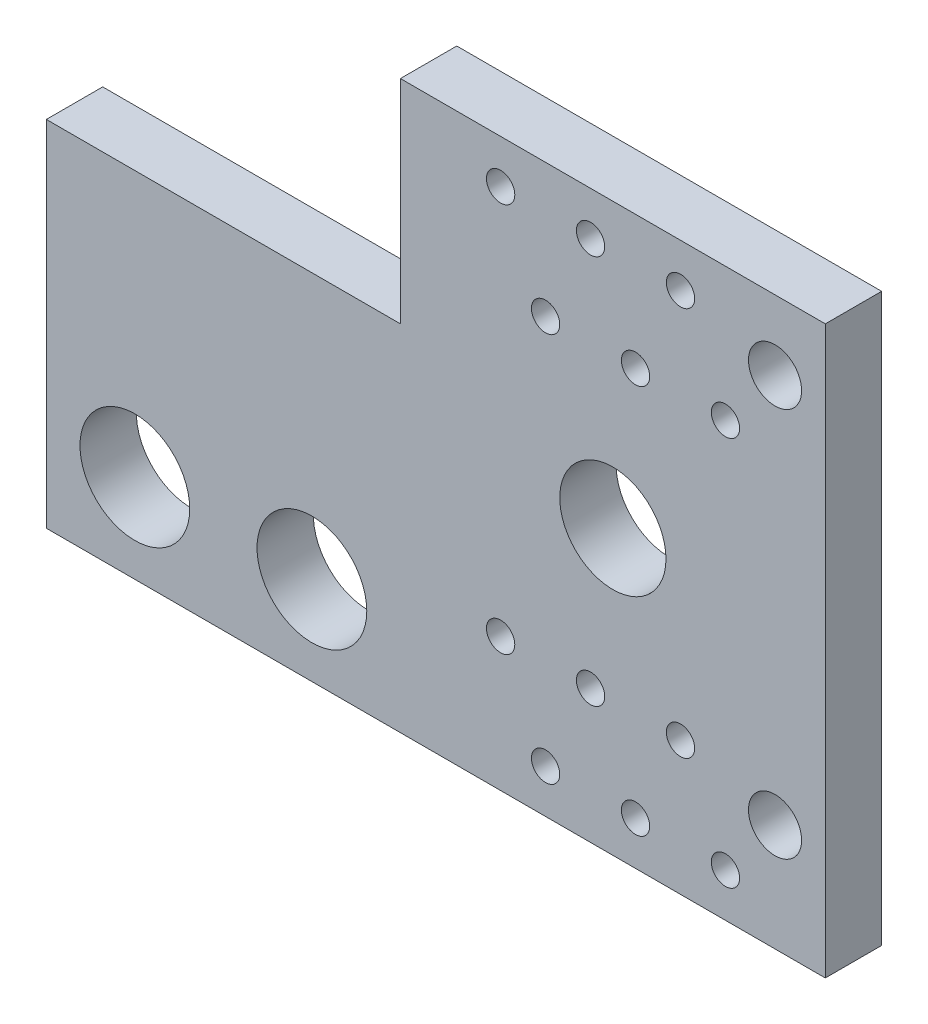
ISO-10303-21;
HEADER;
FILE_DESCRIPTION(('STEP AP214'),'2;1');
FILE_NAME('part.step','',(''),(''),'','','');
FILE_SCHEMA(('AUTOMOTIVE_DESIGN { 1 0 10303 214 1 1 1 1 }'));
ENDSEC;
DATA;
#1=APPLICATION_CONTEXT('core data for automotive mechanical design processes');
#2=APPLICATION_PROTOCOL_DEFINITION('international standard','automotive_design',2000,#1);
#3=PRODUCT_CONTEXT('',#1,'mechanical');
#4=PRODUCT('Part','Part','',(#3));
#5=PRODUCT_RELATED_PRODUCT_CATEGORY('part','',(#4));
#6=PRODUCT_DEFINITION_FORMATION('','',#4);
#7=PRODUCT_DEFINITION_CONTEXT('part definition',#1,'design');
#8=PRODUCT_DEFINITION('design','',#6,#7);
#9=PRODUCT_DEFINITION_SHAPE('','',#8);
#10=(LENGTH_UNIT() NAMED_UNIT(*) SI_UNIT(.MILLI.,.METRE.));
#11=(NAMED_UNIT(*) PLANE_ANGLE_UNIT() SI_UNIT($,.RADIAN.));
#12=(NAMED_UNIT(*) SI_UNIT($,.STERADIAN.) SOLID_ANGLE_UNIT());
#13=UNCERTAINTY_MEASURE_WITH_UNIT(LENGTH_MEASURE(1.E-05),#10,'distance_accuracy_value','');
#14=(GEOMETRIC_REPRESENTATION_CONTEXT(3) GLOBAL_UNCERTAINTY_ASSIGNED_CONTEXT((#13)) GLOBAL_UNIT_ASSIGNED_CONTEXT((#10,
#11,#12)) REPRESENTATION_CONTEXT('',''));
#15=CARTESIAN_POINT('',(0.,0.,0.));
#16=DIRECTION('',(0.,0.,1.));
#17=DIRECTION('',(1.,0.,0.));
#18=AXIS2_PLACEMENT_3D('',#15,#16,#17);
#19=CARTESIAN_POINT('',(0.,0.,-1.59143954));
#20=DIRECTION('',(0.,1.,0.));
#21=DIRECTION('',(1.,0.,0.));
#22=AXIS2_PLACEMENT_3D('',#19,#20,#21);
#23=PLANE('',#22);
#24=DIRECTION('',(1.,0.,0.));
#25=VECTOR('',#24,1.);
#26=CARTESIAN_POINT('',(0.,0.,-1.59143954));
#27=LINE('',#26,#25);
#28=CARTESIAN_POINT('',(0.,0.,-1.59143954));
#29=VERTEX_POINT('',#28);
#30=CARTESIAN_POINT('',(22.,0.,-1.59143954));
#31=VERTEX_POINT('',#30);
#32=EDGE_CURVE('E11',#29,#31,#27,.T.);
#33=ORIENTED_EDGE('',*,*,#32,.T.);
#34=DIRECTION('',(0.,0.,1.));
#35=VECTOR('',#34,1.);
#36=CARTESIAN_POINT('',(22.,0.,-1.59143954));
#37=LINE('',#36,#35);
#38=CARTESIAN_POINT('',(22.,0.,0.));
#39=VERTEX_POINT('',#38);
#40=EDGE_CURVE('E25',#31,#39,#37,.T.);
#41=ORIENTED_EDGE('',*,*,#40,.T.);
#42=DIRECTION('',(1.,0.,0.));
#43=VECTOR('',#42,1.);
#44=CARTESIAN_POINT('',(0.,0.,0.));
#45=LINE('',#44,#43);
#46=CARTESIAN_POINT('',(0.,0.,0.));
#47=VERTEX_POINT('',#46);
#48=EDGE_CURVE('E334',#47,#39,#45,.T.);
#49=ORIENTED_EDGE('',*,*,#48,.F.);
#50=DIRECTION('',(0.,0.,1.));
#51=VECTOR('',#50,1.);
#52=CARTESIAN_POINT('',(0.,0.,-1.59143954));
#53=LINE('',#52,#51);
#54=EDGE_CURVE('E37',#29,#47,#53,.T.);
#55=ORIENTED_EDGE('',*,*,#54,.F.);
#56=EDGE_LOOP('',(#33,#41,#49,#55));
#57=FACE_BOUND('',#56,.T.);
#58=ADVANCED_FACE('F18',(#57),#23,.F.);
#59=CARTESIAN_POINT('',(22.,0.,-1.59143954));
#60=DIRECTION('',(-1.,0.,0.));
#61=DIRECTION('',(0.,1.,0.));
#62=AXIS2_PLACEMENT_3D('',#59,#60,#61);
#63=PLANE('',#62);
#64=DIRECTION('',(0.,1.,0.));
#65=VECTOR('',#64,1.);
#66=CARTESIAN_POINT('',(22.,0.,-1.59143954));
#67=LINE('',#66,#65);
#68=CARTESIAN_POINT('',(22.,16.,-1.59143954));
#69=VERTEX_POINT('',#68);
#70=EDGE_CURVE('E329',#31,#69,#67,.T.);
#71=ORIENTED_EDGE('',*,*,#70,.T.);
#72=DIRECTION('',(0.,0.,1.));
#73=VECTOR('',#72,1.);
#74=CARTESIAN_POINT('',(22.,16.,-1.59143954));
#75=LINE('',#74,#73);
#76=CARTESIAN_POINT('',(22.,16.,0.));
#77=VERTEX_POINT('',#76);
#78=EDGE_CURVE('E327',#69,#77,#75,.T.);
#79=ORIENTED_EDGE('',*,*,#78,.T.);
#80=DIRECTION('',(0.,1.,0.));
#81=VECTOR('',#80,1.);
#82=CARTESIAN_POINT('',(22.,0.,0.));
#83=LINE('',#82,#81);
#84=EDGE_CURVE('E325',#39,#77,#83,.T.);
#85=ORIENTED_EDGE('',*,*,#84,.F.);
#86=ORIENTED_EDGE('',*,*,#40,.F.);
#87=EDGE_LOOP('',(#71,#79,#85,#86));
#88=FACE_BOUND('',#87,.T.);
#89=ADVANCED_FACE('F336',(#88),#63,.F.);
#90=CARTESIAN_POINT('',(22.,16.,-1.59143954));
#91=DIRECTION('',(0.,-1.,0.));
#92=DIRECTION('',(-1.,0.,0.));
#93=AXIS2_PLACEMENT_3D('',#90,#91,#92);
#94=PLANE('',#93);
#95=DIRECTION('',(-1.,0.,0.));
#96=VECTOR('',#95,1.);
#97=CARTESIAN_POINT('',(22.,16.,-1.59143954));
#98=LINE('',#97,#96);
#99=CARTESIAN_POINT('',(10.,16.,-1.59143954));
#100=VERTEX_POINT('',#99);
#101=EDGE_CURVE('E322',#69,#100,#98,.T.);
#102=ORIENTED_EDGE('',*,*,#101,.T.);
#103=DIRECTION('',(0.,0.,1.));
#104=VECTOR('',#103,1.);
#105=CARTESIAN_POINT('',(10.,16.,-1.59143954));
#106=LINE('',#105,#104);
#107=CARTESIAN_POINT('',(10.,16.,0.));
#108=VERTEX_POINT('',#107);
#109=EDGE_CURVE('E319',#100,#108,#106,.T.);
#110=ORIENTED_EDGE('',*,*,#109,.T.);
#111=DIRECTION('',(-1.,0.,0.));
#112=VECTOR('',#111,1.);
#113=CARTESIAN_POINT('',(22.,16.,0.));
#114=LINE('',#113,#112);
#115=EDGE_CURVE('E317',#77,#108,#114,.T.);
#116=ORIENTED_EDGE('',*,*,#115,.F.);
#117=ORIENTED_EDGE('',*,*,#78,.F.);
#118=EDGE_LOOP('',(#102,#110,#116,#117));
#119=FACE_BOUND('',#118,.T.);
#120=ADVANCED_FACE('F352',(#119),#94,.F.);
#121=CARTESIAN_POINT('',(10.,16.,-1.59143954));
#122=DIRECTION('',(1.,0.,0.));
#123=DIRECTION('',(0.,-1.,0.));
#124=AXIS2_PLACEMENT_3D('',#121,#122,#123);
#125=PLANE('',#124);
#126=DIRECTION('',(0.,-1.,0.));
#127=VECTOR('',#126,1.);
#128=CARTESIAN_POINT('',(10.,16.,-1.59143954));
#129=LINE('',#128,#127);
#130=CARTESIAN_POINT('',(10.,10.,-1.59143954));
#131=VERTEX_POINT('',#130);
#132=EDGE_CURVE('E314',#100,#131,#129,.T.);
#133=ORIENTED_EDGE('',*,*,#132,.T.);
#134=DIRECTION('',(0.,0.,1.));
#135=VECTOR('',#134,1.);
#136=CARTESIAN_POINT('',(10.,10.,-1.59143954));
#137=LINE('',#136,#135);
#138=CARTESIAN_POINT('',(10.,10.,0.));
#139=VERTEX_POINT('',#138);
#140=EDGE_CURVE('E311',#131,#139,#137,.T.);
#141=ORIENTED_EDGE('',*,*,#140,.T.);
#142=DIRECTION('',(0.,-1.,0.));
#143=VECTOR('',#142,1.);
#144=CARTESIAN_POINT('',(10.,16.,0.));
#145=LINE('',#144,#143);
#146=EDGE_CURVE('E309',#108,#139,#145,.T.);
#147=ORIENTED_EDGE('',*,*,#146,.F.);
#148=ORIENTED_EDGE('',*,*,#109,.F.);
#149=EDGE_LOOP('',(#133,#141,#147,#148));
#150=FACE_BOUND('',#149,.T.);
#151=ADVANCED_FACE('F355',(#150),#125,.F.);
#152=CARTESIAN_POINT('',(10.,10.,-1.59143954));
#153=DIRECTION('',(0.,-1.,0.));
#154=DIRECTION('',(-1.,0.,0.));
#155=AXIS2_PLACEMENT_3D('',#152,#153,#154);
#156=PLANE('',#155);
#157=DIRECTION('',(-1.,0.,0.));
#158=VECTOR('',#157,1.);
#159=CARTESIAN_POINT('',(10.,10.,-1.59143954));
#160=LINE('',#159,#158);
#161=CARTESIAN_POINT('',(0.,10.,-1.59143954));
#162=VERTEX_POINT('',#161);
#163=EDGE_CURVE('E306',#131,#162,#160,.T.);
#164=ORIENTED_EDGE('',*,*,#163,.T.);
#165=DIRECTION('',(0.,0.,1.));
#166=VECTOR('',#165,1.);
#167=CARTESIAN_POINT('',(0.,10.,-1.59143954));
#168=LINE('',#167,#166);
#169=CARTESIAN_POINT('',(0.,10.,0.));
#170=VERTEX_POINT('',#169);
#171=EDGE_CURVE('E303',#162,#170,#168,.T.);
#172=ORIENTED_EDGE('',*,*,#171,.T.);
#173=DIRECTION('',(-1.,0.,0.));
#174=VECTOR('',#173,1.);
#175=CARTESIAN_POINT('',(10.,10.,0.));
#176=LINE('',#175,#174);
#177=EDGE_CURVE('E301',#139,#170,#176,.T.);
#178=ORIENTED_EDGE('',*,*,#177,.F.);
#179=ORIENTED_EDGE('',*,*,#140,.F.);
#180=EDGE_LOOP('',(#164,#172,#178,#179));
#181=FACE_BOUND('',#180,.T.);
#182=ADVANCED_FACE('F357',(#181),#156,.F.);
#183=CARTESIAN_POINT('',(0.,10.,-1.59143954));
#184=DIRECTION('',(1.,0.,0.));
#185=DIRECTION('',(0.,-1.,0.));
#186=AXIS2_PLACEMENT_3D('',#183,#184,#185);
#187=PLANE('',#186);
#188=DIRECTION('',(0.,-1.,0.));
#189=VECTOR('',#188,1.);
#190=CARTESIAN_POINT('',(0.,10.,-1.59143954));
#191=LINE('',#190,#189);
#192=EDGE_CURVE('E298',#162,#29,#191,.T.);
#193=ORIENTED_EDGE('',*,*,#192,.T.);
#194=ORIENTED_EDGE('',*,*,#54,.T.);
#195=DIRECTION('',(0.,-1.,0.));
#196=VECTOR('',#195,1.);
#197=CARTESIAN_POINT('',(0.,10.,0.));
#198=LINE('',#197,#196);
#199=EDGE_CURVE('E295',#170,#47,#198,.T.);
#200=ORIENTED_EDGE('',*,*,#199,.F.);
#201=ORIENTED_EDGE('',*,*,#171,.F.);
#202=EDGE_LOOP('',(#193,#194,#200,#201));
#203=FACE_BOUND('',#202,.T.);
#204=ADVANCED_FACE('F344',(#203),#187,.F.);
#205=CARTESIAN_POINT('',(7.50000024,2.50000008,-1.59143954));
#206=DIRECTION('',(0.,0.,-1.));
#207=DIRECTION('',(1.,0.,0.));
#208=AXIS2_PLACEMENT_3D('',#205,#206,#207);
#209=CYLINDRICAL_SURFACE('',#208,1.54999944);
#210=DIRECTION('',(0.,0.,1.));
#211=VECTOR('',#210,1.);
#212=CARTESIAN_POINT('',(9.04999968,2.50000008,-1.59143954));
#213=LINE('',#212,#211);
#214=CARTESIAN_POINT('',(9.04999968,2.50000008,-1.59143954));
#215=VERTEX_POINT('',#214);
#216=CARTESIAN_POINT('',(9.04999968,2.50000008,0.));
#217=VERTEX_POINT('',#216);
#218=EDGE_CURVE('E293',#215,#217,#213,.T.);
#219=ORIENTED_EDGE('',*,*,#218,.T.);
#220=CARTESIAN_POINT('',(7.50000024,2.50000008,0.));
#221=DIRECTION('',(0.,0.,1.));
#222=DIRECTION('',(1.,0.,0.));
#223=AXIS2_PLACEMENT_3D('',#220,#221,#222);
#224=CIRCLE('',#223,1.54999944);
#225=EDGE_CURVE('E290',#217,#217,#224,.T.);
#226=ORIENTED_EDGE('',*,*,#225,.T.);
#227=ORIENTED_EDGE('',*,*,#218,.F.);
#228=CARTESIAN_POINT('',(7.50000024,2.50000008,-1.59143954));
#229=DIRECTION('',(0.,0.,1.));
#230=DIRECTION('',(1.,0.,0.));
#231=AXIS2_PLACEMENT_3D('',#228,#229,#230);
#232=CIRCLE('',#231,1.54999944);
#233=EDGE_CURVE('E288',#215,#215,#232,.T.);
#234=ORIENTED_EDGE('',*,*,#233,.F.);
#235=EDGE_LOOP('',(#219,#226,#227,#234));
#236=FACE_BOUND('',#235,.T.);
#237=ADVANCED_FACE('F365',(#236),#209,.F.);
#238=CARTESIAN_POINT('',(2.50000008,2.50000008,-1.59143954));
#239=DIRECTION('',(0.,0.,-1.));
#240=DIRECTION('',(1.,0.,0.));
#241=AXIS2_PLACEMENT_3D('',#238,#239,#240);
#242=CYLINDRICAL_SURFACE('',#241,1.54999944);
#243=DIRECTION('',(0.,0.,1.));
#244=VECTOR('',#243,1.);
#245=CARTESIAN_POINT('',(4.04999952,2.50000008,-1.59143954));
#246=LINE('',#245,#244);
#247=CARTESIAN_POINT('',(4.04999952,2.50000008,-1.59143954));
#248=VERTEX_POINT('',#247);
#249=CARTESIAN_POINT('',(4.04999952,2.50000008,0.));
#250=VERTEX_POINT('',#249);
#251=EDGE_CURVE('E286',#248,#250,#246,.T.);
#252=ORIENTED_EDGE('',*,*,#251,.T.);
#253=CARTESIAN_POINT('',(2.50000008,2.50000008,0.));
#254=DIRECTION('',(0.,0.,1.));
#255=DIRECTION('',(1.,0.,0.));
#256=AXIS2_PLACEMENT_3D('',#253,#254,#255);
#257=CIRCLE('',#256,1.54999944);
#258=EDGE_CURVE('E283',#250,#250,#257,.T.);
#259=ORIENTED_EDGE('',*,*,#258,.T.);
#260=ORIENTED_EDGE('',*,*,#251,.F.);
#261=CARTESIAN_POINT('',(2.50000008,2.50000008,-1.59143954));
#262=DIRECTION('',(0.,0.,1.));
#263=DIRECTION('',(1.,0.,0.));
#264=AXIS2_PLACEMENT_3D('',#261,#262,#263);
#265=CIRCLE('',#264,1.54999944);
#266=EDGE_CURVE('E281',#248,#248,#265,.T.);
#267=ORIENTED_EDGE('',*,*,#266,.F.);
#268=EDGE_LOOP('',(#252,#259,#260,#267));
#269=FACE_BOUND('',#268,.T.);
#270=ADVANCED_FACE('F409',(#269),#242,.F.);
#271=CARTESIAN_POINT('',(14.09999974,1.23000008,-1.59143954));
#272=DIRECTION('',(0.,0.,-1.));
#273=DIRECTION('',(1.,0.,0.));
#274=AXIS2_PLACEMENT_3D('',#271,#272,#273);
#275=CYLINDRICAL_SURFACE('',#274,0.3999992);
#276=DIRECTION('',(0.,0.,1.));
#277=VECTOR('',#276,1.);
#278=CARTESIAN_POINT('',(14.49999894,1.23000008,-1.59143954));
#279=LINE('',#278,#277);
#280=CARTESIAN_POINT('',(14.49999894,1.23000008,-1.59143954));
#281=VERTEX_POINT('',#280);
#282=CARTESIAN_POINT('',(14.49999894,1.23000008,0.));
#283=VERTEX_POINT('',#282);
#284=EDGE_CURVE('E279',#281,#283,#279,.T.);
#285=ORIENTED_EDGE('',*,*,#284,.T.);
#286=CARTESIAN_POINT('',(14.09999974,1.23000008,0.));
#287=DIRECTION('',(0.,0.,1.));
#288=DIRECTION('',(1.,0.,0.));
#289=AXIS2_PLACEMENT_3D('',#286,#287,#288);
#290=CIRCLE('',#289,0.3999992);
#291=EDGE_CURVE('E276',#283,#283,#290,.T.);
#292=ORIENTED_EDGE('',*,*,#291,.T.);
#293=ORIENTED_EDGE('',*,*,#284,.F.);
#294=CARTESIAN_POINT('',(14.09999974,1.23000008,-1.59143954));
#295=DIRECTION('',(0.,0.,1.));
#296=DIRECTION('',(1.,0.,0.));
#297=AXIS2_PLACEMENT_3D('',#294,#295,#296);
#298=CIRCLE('',#297,0.3999992);
#299=EDGE_CURVE('E274',#281,#281,#298,.T.);
#300=ORIENTED_EDGE('',*,*,#299,.F.);
#301=EDGE_LOOP('',(#285,#292,#293,#300));
#302=FACE_BOUND('',#301,.T.);
#303=ADVANCED_FACE('F419',(#302),#275,.F.);
#304=CARTESIAN_POINT('',(12.82999974,3.77000008,-1.59143954));
#305=DIRECTION('',(0.,0.,-1.));
#306=DIRECTION('',(1.,0.,0.));
#307=AXIS2_PLACEMENT_3D('',#304,#305,#306);
#308=CYLINDRICAL_SURFACE('',#307,0.3999992);
#309=DIRECTION('',(0.,0.,1.));
#310=VECTOR('',#309,1.);
#311=CARTESIAN_POINT('',(13.22999894,3.77000008,-1.59143954));
#312=LINE('',#311,#310);
#313=CARTESIAN_POINT('',(13.22999894,3.77000008,-1.59143954));
#314=VERTEX_POINT('',#313);
#315=CARTESIAN_POINT('',(13.22999894,3.77000008,0.));
#316=VERTEX_POINT('',#315);
#317=EDGE_CURVE('E272',#314,#316,#312,.T.);
#318=ORIENTED_EDGE('',*,*,#317,.T.);
#319=CARTESIAN_POINT('',(12.82999974,3.77000008,0.));
#320=DIRECTION('',(0.,0.,1.));
#321=DIRECTION('',(1.,0.,0.));
#322=AXIS2_PLACEMENT_3D('',#319,#320,#321);
#323=CIRCLE('',#322,0.3999992);
#324=EDGE_CURVE('E269',#316,#316,#323,.T.);
#325=ORIENTED_EDGE('',*,*,#324,.T.);
#326=ORIENTED_EDGE('',*,*,#317,.F.);
#327=CARTESIAN_POINT('',(12.82999974,3.77000008,-1.59143954));
#328=DIRECTION('',(0.,0.,1.));
#329=DIRECTION('',(1.,0.,0.));
#330=AXIS2_PLACEMENT_3D('',#327,#328,#329);
#331=CIRCLE('',#330,0.3999992);
#332=EDGE_CURVE('E267',#314,#314,#331,.T.);
#333=ORIENTED_EDGE('',*,*,#332,.F.);
#334=EDGE_LOOP('',(#318,#325,#326,#333));
#335=FACE_BOUND('',#334,.T.);
#336=ADVANCED_FACE('F429',(#335),#308,.F.);
#337=CARTESIAN_POINT('',(14.09999974,12.23000094,-1.59143954));
#338=DIRECTION('',(0.,0.,-1.));
#339=DIRECTION('',(1.,0.,0.));
#340=AXIS2_PLACEMENT_3D('',#337,#338,#339);
#341=CYLINDRICAL_SURFACE('',#340,0.3999992);
#342=DIRECTION('',(0.,0.,1.));
#343=VECTOR('',#342,1.);
#344=CARTESIAN_POINT('',(14.49999894,12.23000094,-1.59143954));
#345=LINE('',#344,#343);
#346=CARTESIAN_POINT('',(14.49999894,12.23000094,-1.59143954));
#347=VERTEX_POINT('',#346);
#348=CARTESIAN_POINT('',(14.49999894,12.23000094,0.));
#349=VERTEX_POINT('',#348);
#350=EDGE_CURVE('E265',#347,#349,#345,.T.);
#351=ORIENTED_EDGE('',*,*,#350,.T.);
#352=CARTESIAN_POINT('',(14.09999974,12.23000094,0.));
#353=DIRECTION('',(0.,0.,1.));
#354=DIRECTION('',(1.,0.,0.));
#355=AXIS2_PLACEMENT_3D('',#352,#353,#354);
#356=CIRCLE('',#355,0.3999992);
#357=EDGE_CURVE('E262',#349,#349,#356,.T.);
#358=ORIENTED_EDGE('',*,*,#357,.T.);
#359=ORIENTED_EDGE('',*,*,#350,.F.);
#360=CARTESIAN_POINT('',(14.09999974,12.23000094,-1.59143954));
#361=DIRECTION('',(0.,0.,1.));
#362=DIRECTION('',(1.,0.,0.));
#363=AXIS2_PLACEMENT_3D('',#360,#361,#362);
#364=CIRCLE('',#363,0.3999992);
#365=EDGE_CURVE('E260',#347,#347,#364,.T.);
#366=ORIENTED_EDGE('',*,*,#365,.F.);
#367=EDGE_LOOP('',(#351,#358,#359,#366));
#368=FACE_BOUND('',#367,.T.);
#369=ADVANCED_FACE('F439',(#368),#341,.F.);
#370=CARTESIAN_POINT('',(12.82999974,14.77000094,-1.59143954));
#371=DIRECTION('',(0.,0.,-1.));
#372=DIRECTION('',(1.,0.,0.));
#373=AXIS2_PLACEMENT_3D('',#370,#371,#372);
#374=CYLINDRICAL_SURFACE('',#373,0.3999992);
#375=DIRECTION('',(0.,0.,1.));
#376=VECTOR('',#375,1.);
#377=CARTESIAN_POINT('',(13.22999894,14.77000094,-1.59143954));
#378=LINE('',#377,#376);
#379=CARTESIAN_POINT('',(13.22999894,14.77000094,-1.59143954));
#380=VERTEX_POINT('',#379);
#381=CARTESIAN_POINT('',(13.22999894,14.77000094,0.));
#382=VERTEX_POINT('',#381);
#383=EDGE_CURVE('E258',#380,#382,#378,.T.);
#384=ORIENTED_EDGE('',*,*,#383,.T.);
#385=CARTESIAN_POINT('',(12.82999974,14.77000094,0.));
#386=DIRECTION('',(0.,0.,1.));
#387=DIRECTION('',(1.,0.,0.));
#388=AXIS2_PLACEMENT_3D('',#385,#386,#387);
#389=CIRCLE('',#388,0.3999992);
#390=EDGE_CURVE('E255',#382,#382,#389,.T.);
#391=ORIENTED_EDGE('',*,*,#390,.T.);
#392=ORIENTED_EDGE('',*,*,#383,.F.);
#393=CARTESIAN_POINT('',(12.82999974,14.77000094,-1.59143954));
#394=DIRECTION('',(0.,0.,1.));
#395=DIRECTION('',(1.,0.,0.));
#396=AXIS2_PLACEMENT_3D('',#393,#394,#395);
#397=CIRCLE('',#396,0.3999992);
#398=EDGE_CURVE('E253',#380,#380,#397,.T.);
#399=ORIENTED_EDGE('',*,*,#398,.F.);
#400=EDGE_LOOP('',(#384,#391,#392,#399));
#401=FACE_BOUND('',#400,.T.);
#402=ADVANCED_FACE('F449',(#401),#374,.F.);
#403=CARTESIAN_POINT('',(16.00000102,7.99999924,-1.59143954));
#404=DIRECTION('',(0.,0.,-1.));
#405=DIRECTION('',(1.,0.,0.));
#406=AXIS2_PLACEMENT_3D('',#403,#404,#405);
#407=CYLINDRICAL_SURFACE('',#406,1.49999954);
#408=DIRECTION('',(0.,0.,1.));
#409=VECTOR('',#408,1.);
#410=CARTESIAN_POINT('',(17.50000056,7.99999924,-1.59143954));
#411=LINE('',#410,#409);
#412=CARTESIAN_POINT('',(17.50000056,7.99999924,-1.59143954));
#413=VERTEX_POINT('',#412);
#414=CARTESIAN_POINT('',(17.50000056,7.99999924,0.));
#415=VERTEX_POINT('',#414);
#416=EDGE_CURVE('E251',#413,#415,#411,.T.);
#417=ORIENTED_EDGE('',*,*,#416,.T.);
#418=CARTESIAN_POINT('',(16.00000102,7.99999924,0.));
#419=DIRECTION('',(0.,0.,1.));
#420=DIRECTION('',(1.,0.,0.));
#421=AXIS2_PLACEMENT_3D('',#418,#419,#420);
#422=CIRCLE('',#421,1.49999954);
#423=EDGE_CURVE('E248',#415,#415,#422,.T.);
#424=ORIENTED_EDGE('',*,*,#423,.T.);
#425=ORIENTED_EDGE('',*,*,#416,.F.);
#426=CARTESIAN_POINT('',(16.00000102,7.99999924,-1.59143954));
#427=DIRECTION('',(0.,0.,1.));
#428=DIRECTION('',(1.,0.,0.));
#429=AXIS2_PLACEMENT_3D('',#426,#427,#428);
#430=CIRCLE('',#429,1.49999954);
#431=EDGE_CURVE('E245',#413,#413,#430,.T.);
#432=ORIENTED_EDGE('',*,*,#431,.F.);
#433=EDGE_LOOP('',(#417,#424,#425,#432));
#434=FACE_BOUND('',#433,.T.);
#435=ADVANCED_FACE('F459',(#434),#407,.F.);
#436=CARTESIAN_POINT('',(15.36999974,14.77000094,-1.59143954));
#437=DIRECTION('',(0.,0.,-1.));
#438=DIRECTION('',(1.,0.,0.));
#439=AXIS2_PLACEMENT_3D('',#436,#437,#438);
#440=CYLINDRICAL_SURFACE('',#439,0.3999992);
#441=DIRECTION('',(0.,0.,1.));
#442=VECTOR('',#441,1.);
#443=CARTESIAN_POINT('',(15.76999894,14.77000094,-1.59143954));
#444=LINE('',#443,#442);
#445=CARTESIAN_POINT('',(15.76999894,14.77000094,-1.59143954));
#446=VERTEX_POINT('',#445);
#447=CARTESIAN_POINT('',(15.76999894,14.77000094,0.));
#448=VERTEX_POINT('',#447);
#449=EDGE_CURVE('E243',#446,#448,#444,.T.);
#450=ORIENTED_EDGE('',*,*,#449,.T.);
#451=CARTESIAN_POINT('',(15.36999974,14.77000094,0.));
#452=DIRECTION('',(0.,0.,1.));
#453=DIRECTION('',(1.,0.,0.));
#454=AXIS2_PLACEMENT_3D('',#451,#452,#453);
#455=CIRCLE('',#454,0.3999992);
#456=EDGE_CURVE('E240',#448,#448,#455,.T.);
#457=ORIENTED_EDGE('',*,*,#456,.T.);
#458=ORIENTED_EDGE('',*,*,#449,.F.);
#459=CARTESIAN_POINT('',(15.36999974,14.77000094,-1.59143954));
#460=DIRECTION('',(0.,0.,1.));
#461=DIRECTION('',(1.,0.,0.));
#462=AXIS2_PLACEMENT_3D('',#459,#460,#461);
#463=CIRCLE('',#462,0.3999992);
#464=EDGE_CURVE('E238',#446,#446,#463,.T.);
#465=ORIENTED_EDGE('',*,*,#464,.F.);
#466=EDGE_LOOP('',(#450,#457,#458,#465));
#467=FACE_BOUND('',#466,.T.);
#468=ADVANCED_FACE('F469',(#467),#440,.F.);
#469=CARTESIAN_POINT('',(16.63999974,1.23000008,-1.59143954));
#470=DIRECTION('',(0.,0.,-1.));
#471=DIRECTION('',(1.,0.,0.));
#472=AXIS2_PLACEMENT_3D('',#469,#470,#471);
#473=CYLINDRICAL_SURFACE('',#472,0.3999992);
#474=DIRECTION('',(0.,0.,1.));
#475=VECTOR('',#474,1.);
#476=CARTESIAN_POINT('',(17.03999894,1.23000008,-1.59143954));
#477=LINE('',#476,#475);
#478=CARTESIAN_POINT('',(17.03999894,1.23000008,-1.59143954));
#479=VERTEX_POINT('',#478);
#480=CARTESIAN_POINT('',(17.03999894,1.23000008,0.));
#481=VERTEX_POINT('',#480);
#482=EDGE_CURVE('E236',#479,#481,#477,.T.);
#483=ORIENTED_EDGE('',*,*,#482,.T.);
#484=CARTESIAN_POINT('',(16.63999974,1.23000008,0.));
#485=DIRECTION('',(0.,0.,1.));
#486=DIRECTION('',(1.,0.,0.));
#487=AXIS2_PLACEMENT_3D('',#484,#485,#486);
#488=CIRCLE('',#487,0.3999992);
#489=EDGE_CURVE('E233',#481,#481,#488,.T.);
#490=ORIENTED_EDGE('',*,*,#489,.T.);
#491=ORIENTED_EDGE('',*,*,#482,.F.);
#492=CARTESIAN_POINT('',(16.63999974,1.23000008,-1.59143954));
#493=DIRECTION('',(0.,0.,1.));
#494=DIRECTION('',(1.,0.,0.));
#495=AXIS2_PLACEMENT_3D('',#492,#493,#494);
#496=CIRCLE('',#495,0.3999992);
#497=EDGE_CURVE('E231',#479,#479,#496,.T.);
#498=ORIENTED_EDGE('',*,*,#497,.F.);
#499=EDGE_LOOP('',(#483,#490,#491,#498));
#500=FACE_BOUND('',#499,.T.);
#501=ADVANCED_FACE('F479',(#500),#473,.F.);
#502=CARTESIAN_POINT('',(17.90999974,3.77000008,-1.59143954));
#503=DIRECTION('',(0.,0.,-1.));
#504=DIRECTION('',(1.,0.,0.));
#505=AXIS2_PLACEMENT_3D('',#502,#503,#504);
#506=CYLINDRICAL_SURFACE('',#505,0.3999992);
#507=DIRECTION('',(0.,0.,1.));
#508=VECTOR('',#507,1.);
#509=CARTESIAN_POINT('',(18.30999894,3.77000008,-1.59143954));
#510=LINE('',#509,#508);
#511=CARTESIAN_POINT('',(18.30999894,3.77000008,-1.59143954));
#512=VERTEX_POINT('',#511);
#513=CARTESIAN_POINT('',(18.30999894,3.77000008,0.));
#514=VERTEX_POINT('',#513);
#515=EDGE_CURVE('E229',#512,#514,#510,.T.);
#516=ORIENTED_EDGE('',*,*,#515,.T.);
#517=CARTESIAN_POINT('',(17.90999974,3.77000008,0.));
#518=DIRECTION('',(0.,0.,1.));
#519=DIRECTION('',(1.,0.,0.));
#520=AXIS2_PLACEMENT_3D('',#517,#518,#519);
#521=CIRCLE('',#520,0.3999992);
#522=EDGE_CURVE('E226',#514,#514,#521,.T.);
#523=ORIENTED_EDGE('',*,*,#522,.T.);
#524=ORIENTED_EDGE('',*,*,#515,.F.);
#525=CARTESIAN_POINT('',(17.90999974,3.77000008,-1.59143954));
#526=DIRECTION('',(0.,0.,1.));
#527=DIRECTION('',(1.,0.,0.));
#528=AXIS2_PLACEMENT_3D('',#525,#526,#527);
#529=CIRCLE('',#528,0.3999992);
#530=EDGE_CURVE('E224',#512,#512,#529,.T.);
#531=ORIENTED_EDGE('',*,*,#530,.F.);
#532=EDGE_LOOP('',(#516,#523,#524,#531));
#533=FACE_BOUND('',#532,.T.);
#534=ADVANCED_FACE('F489',(#533),#506,.F.);
#535=CARTESIAN_POINT('',(19.17999974,1.23000008,-1.59143954));
#536=DIRECTION('',(0.,0.,-1.));
#537=DIRECTION('',(1.,0.,0.));
#538=AXIS2_PLACEMENT_3D('',#535,#536,#537);
#539=CYLINDRICAL_SURFACE('',#538,0.3999992);
#540=DIRECTION('',(0.,0.,1.));
#541=VECTOR('',#540,1.);
#542=CARTESIAN_POINT('',(19.57999894,1.23000008,-1.59143954));
#543=LINE('',#542,#541);
#544=CARTESIAN_POINT('',(19.57999894,1.23000008,-1.59143954));
#545=VERTEX_POINT('',#544);
#546=CARTESIAN_POINT('',(19.57999894,1.23000008,0.));
#547=VERTEX_POINT('',#546);
#548=EDGE_CURVE('E222',#545,#547,#543,.T.);
#549=ORIENTED_EDGE('',*,*,#548,.T.);
#550=CARTESIAN_POINT('',(19.17999974,1.23000008,0.));
#551=DIRECTION('',(0.,0.,1.));
#552=DIRECTION('',(1.,0.,0.));
#553=AXIS2_PLACEMENT_3D('',#550,#551,#552);
#554=CIRCLE('',#553,0.3999992);
#555=EDGE_CURVE('E219',#547,#547,#554,.T.);
#556=ORIENTED_EDGE('',*,*,#555,.T.);
#557=ORIENTED_EDGE('',*,*,#548,.F.);
#558=CARTESIAN_POINT('',(19.17999974,1.23000008,-1.59143954));
#559=DIRECTION('',(0.,0.,1.));
#560=DIRECTION('',(1.,0.,0.));
#561=AXIS2_PLACEMENT_3D('',#558,#559,#560);
#562=CIRCLE('',#561,0.3999992);
#563=EDGE_CURVE('E217',#545,#545,#562,.T.);
#564=ORIENTED_EDGE('',*,*,#563,.F.);
#565=EDGE_LOOP('',(#549,#556,#557,#564));
#566=FACE_BOUND('',#565,.T.);
#567=ADVANCED_FACE('F499',(#566),#539,.F.);
#568=CARTESIAN_POINT('',(20.57999948,3.02999902,-1.59143954));
#569=DIRECTION('',(0.,0.,-1.));
#570=DIRECTION('',(1.,0.,0.));
#571=AXIS2_PLACEMENT_3D('',#568,#569,#570);
#572=CYLINDRICAL_SURFACE('',#571,0.7499985);
#573=DIRECTION('',(0.,0.,1.));
#574=VECTOR('',#573,1.);
#575=CARTESIAN_POINT('',(21.32999798,3.02999902,-1.59143954));
#576=LINE('',#575,#574);
#577=CARTESIAN_POINT('',(21.32999798,3.02999902,-1.59143954));
#578=VERTEX_POINT('',#577);
#579=CARTESIAN_POINT('',(21.32999798,3.02999902,0.));
#580=VERTEX_POINT('',#579);
#581=EDGE_CURVE('E215',#578,#580,#576,.T.);
#582=ORIENTED_EDGE('',*,*,#581,.T.);
#583=CARTESIAN_POINT('',(20.57999948,3.02999902,0.));
#584=DIRECTION('',(0.,0.,1.));
#585=DIRECTION('',(1.,0.,0.));
#586=AXIS2_PLACEMENT_3D('',#583,#584,#585);
#587=CIRCLE('',#586,0.7499985);
#588=EDGE_CURVE('E212',#580,#580,#587,.T.);
#589=ORIENTED_EDGE('',*,*,#588,.T.);
#590=ORIENTED_EDGE('',*,*,#581,.F.);
#591=CARTESIAN_POINT('',(20.57999948,3.02999902,-1.59143954));
#592=DIRECTION('',(0.,0.,1.));
#593=DIRECTION('',(1.,0.,0.));
#594=AXIS2_PLACEMENT_3D('',#591,#592,#593);
#595=CIRCLE('',#594,0.7499985);
#596=EDGE_CURVE('E210',#578,#578,#595,.T.);
#597=ORIENTED_EDGE('',*,*,#596,.F.);
#598=EDGE_LOOP('',(#582,#589,#590,#597));
#599=FACE_BOUND('',#598,.T.);
#600=ADVANCED_FACE('F509',(#599),#572,.F.);
#601=CARTESIAN_POINT('',(15.36999974,3.77000008,-1.59143954));
#602=DIRECTION('',(0.,0.,-1.));
#603=DIRECTION('',(1.,0.,0.));
#604=AXIS2_PLACEMENT_3D('',#601,#602,#603);
#605=CYLINDRICAL_SURFACE('',#604,0.3999992);
#606=DIRECTION('',(0.,0.,1.));
#607=VECTOR('',#606,1.);
#608=CARTESIAN_POINT('',(15.76999894,3.77000008,-1.59143954));
#609=LINE('',#608,#607);
#610=CARTESIAN_POINT('',(15.76999894,3.77000008,-1.59143954));
#611=VERTEX_POINT('',#610);
#612=CARTESIAN_POINT('',(15.76999894,3.77000008,0.));
#613=VERTEX_POINT('',#612);
#614=EDGE_CURVE('E208',#611,#613,#609,.T.);
#615=ORIENTED_EDGE('',*,*,#614,.T.);
#616=CARTESIAN_POINT('',(15.36999974,3.77000008,0.));
#617=DIRECTION('',(0.,0.,1.));
#618=DIRECTION('',(1.,0.,0.));
#619=AXIS2_PLACEMENT_3D('',#616,#617,#618);
#620=CIRCLE('',#619,0.3999992);
#621=EDGE_CURVE('E205',#613,#613,#620,.T.);
#622=ORIENTED_EDGE('',*,*,#621,.T.);
#623=ORIENTED_EDGE('',*,*,#614,.F.);
#624=CARTESIAN_POINT('',(15.36999974,3.77000008,-1.59143954));
#625=DIRECTION('',(0.,0.,1.));
#626=DIRECTION('',(1.,0.,0.));
#627=AXIS2_PLACEMENT_3D('',#624,#625,#626);
#628=CIRCLE('',#627,0.3999992);
#629=EDGE_CURVE('E203',#611,#611,#628,.T.);
#630=ORIENTED_EDGE('',*,*,#629,.F.);
#631=EDGE_LOOP('',(#615,#622,#623,#630));
#632=FACE_BOUND('',#631,.T.);
#633=ADVANCED_FACE('F519',(#632),#605,.F.);
#634=CARTESIAN_POINT('',(16.63999974,12.23000094,-1.59143954));
#635=DIRECTION('',(0.,0.,-1.));
#636=DIRECTION('',(1.,0.,0.));
#637=AXIS2_PLACEMENT_3D('',#634,#635,#636);
#638=CYLINDRICAL_SURFACE('',#637,0.3999992);
#639=DIRECTION('',(0.,0.,1.));
#640=VECTOR('',#639,1.);
#641=CARTESIAN_POINT('',(17.03999894,12.23000094,-1.59143954));
#642=LINE('',#641,#640);
#643=CARTESIAN_POINT('',(17.03999894,12.23000094,-1.59143954));
#644=VERTEX_POINT('',#643);
#645=CARTESIAN_POINT('',(17.03999894,12.23000094,0.));
#646=VERTEX_POINT('',#645);
#647=EDGE_CURVE('E201',#644,#646,#642,.T.);
#648=ORIENTED_EDGE('',*,*,#647,.T.);
#649=CARTESIAN_POINT('',(16.63999974,12.23000094,0.));
#650=DIRECTION('',(0.,0.,1.));
#651=DIRECTION('',(1.,0.,0.));
#652=AXIS2_PLACEMENT_3D('',#649,#650,#651);
#653=CIRCLE('',#652,0.3999992);
#654=EDGE_CURVE('E198',#646,#646,#653,.T.);
#655=ORIENTED_EDGE('',*,*,#654,.T.);
#656=ORIENTED_EDGE('',*,*,#647,.F.);
#657=CARTESIAN_POINT('',(16.63999974,12.23000094,-1.59143954));
#658=DIRECTION('',(0.,0.,1.));
#659=DIRECTION('',(1.,0.,0.));
#660=AXIS2_PLACEMENT_3D('',#657,#658,#659);
#661=CIRCLE('',#660,0.3999992);
#662=EDGE_CURVE('E196',#644,#644,#661,.T.);
#663=ORIENTED_EDGE('',*,*,#662,.F.);
#664=EDGE_LOOP('',(#648,#655,#656,#663));
#665=FACE_BOUND('',#664,.T.);
#666=ADVANCED_FACE('F529',(#665),#638,.F.);
#667=CARTESIAN_POINT('',(19.17999974,12.23000094,-1.59143954));
#668=DIRECTION('',(0.,0.,-1.));
#669=DIRECTION('',(1.,0.,0.));
#670=AXIS2_PLACEMENT_3D('',#667,#668,#669);
#671=CYLINDRICAL_SURFACE('',#670,0.3999992);
#672=DIRECTION('',(0.,0.,1.));
#673=VECTOR('',#672,1.);
#674=CARTESIAN_POINT('',(19.57999894,12.23000094,-1.59143954));
#675=LINE('',#674,#673);
#676=CARTESIAN_POINT('',(19.57999894,12.23000094,-1.59143954));
#677=VERTEX_POINT('',#676);
#678=CARTESIAN_POINT('',(19.57999894,12.23000094,0.));
#679=VERTEX_POINT('',#678);
#680=EDGE_CURVE('E194',#677,#679,#675,.T.);
#681=ORIENTED_EDGE('',*,*,#680,.T.);
#682=CARTESIAN_POINT('',(19.17999974,12.23000094,0.));
#683=DIRECTION('',(0.,0.,1.));
#684=DIRECTION('',(1.,0.,0.));
#685=AXIS2_PLACEMENT_3D('',#682,#683,#684);
#686=CIRCLE('',#685,0.3999992);
#687=EDGE_CURVE('E191',#679,#679,#686,.T.);
#688=ORIENTED_EDGE('',*,*,#687,.T.);
#689=ORIENTED_EDGE('',*,*,#680,.F.);
#690=CARTESIAN_POINT('',(19.17999974,12.23000094,-1.59143954));
#691=DIRECTION('',(0.,0.,1.));
#692=DIRECTION('',(1.,0.,0.));
#693=AXIS2_PLACEMENT_3D('',#690,#691,#692);
#694=CIRCLE('',#693,0.3999992);
#695=EDGE_CURVE('E189',#677,#677,#694,.T.);
#696=ORIENTED_EDGE('',*,*,#695,.F.);
#697=EDGE_LOOP('',(#681,#688,#689,#696));
#698=FACE_BOUND('',#697,.T.);
#699=ADVANCED_FACE('F539',(#698),#671,.F.);
#700=CARTESIAN_POINT('',(17.90999974,14.77000094,-1.59143954));
#701=DIRECTION('',(0.,0.,-1.));
#702=DIRECTION('',(1.,0.,0.));
#703=AXIS2_PLACEMENT_3D('',#700,#701,#702);
#704=CYLINDRICAL_SURFACE('',#703,0.3999992);
#705=DIRECTION('',(0.,0.,1.));
#706=VECTOR('',#705,1.);
#707=CARTESIAN_POINT('',(18.30999894,14.77000094,-1.59143954));
#708=LINE('',#707,#706);
#709=CARTESIAN_POINT('',(18.30999894,14.77000094,-1.59143954));
#710=VERTEX_POINT('',#709);
#711=CARTESIAN_POINT('',(18.30999894,14.77000094,0.));
#712=VERTEX_POINT('',#711);
#713=EDGE_CURVE('E187',#710,#712,#708,.T.);
#714=ORIENTED_EDGE('',*,*,#713,.T.);
#715=CARTESIAN_POINT('',(17.90999974,14.77000094,0.));
#716=DIRECTION('',(0.,0.,1.));
#717=DIRECTION('',(1.,0.,0.));
#718=AXIS2_PLACEMENT_3D('',#715,#716,#717);
#719=CIRCLE('',#718,0.3999992);
#720=EDGE_CURVE('E184',#712,#712,#719,.T.);
#721=ORIENTED_EDGE('',*,*,#720,.T.);
#722=ORIENTED_EDGE('',*,*,#713,.F.);
#723=CARTESIAN_POINT('',(17.90999974,14.77000094,-1.59143954));
#724=DIRECTION('',(0.,0.,1.));
#725=DIRECTION('',(1.,0.,0.));
#726=AXIS2_PLACEMENT_3D('',#723,#724,#725);
#727=CIRCLE('',#726,0.3999992);
#728=EDGE_CURVE('E182',#710,#710,#727,.T.);
#729=ORIENTED_EDGE('',*,*,#728,.F.);
#730=EDGE_LOOP('',(#714,#721,#722,#729));
#731=FACE_BOUND('',#730,.T.);
#732=ADVANCED_FACE('F549',(#731),#704,.F.);
#733=CARTESIAN_POINT('',(20.57999948,14.02999988,-1.59143954));
#734=DIRECTION('',(0.,0.,-1.));
#735=DIRECTION('',(1.,0.,0.));
#736=AXIS2_PLACEMENT_3D('',#733,#734,#735);
#737=CYLINDRICAL_SURFACE('',#736,0.7499985);
#738=DIRECTION('',(0.,0.,1.));
#739=VECTOR('',#738,1.);
#740=CARTESIAN_POINT('',(21.32999798,14.02999988,-1.59143954));
#741=LINE('',#740,#739);
#742=CARTESIAN_POINT('',(21.32999798,14.02999988,-1.59143954));
#743=VERTEX_POINT('',#742);
#744=CARTESIAN_POINT('',(21.32999798,14.02999988,0.));
#745=VERTEX_POINT('',#744);
#746=EDGE_CURVE('E178',#743,#745,#741,.T.);
#747=ORIENTED_EDGE('',*,*,#746,.T.);
#748=CARTESIAN_POINT('',(20.57999948,14.02999988,0.));
#749=DIRECTION('',(0.,0.,1.));
#750=DIRECTION('',(1.,0.,0.));
#751=AXIS2_PLACEMENT_3D('',#748,#749,#750);
#752=CIRCLE('',#751,0.7499985);
#753=EDGE_CURVE('E175',#745,#745,#752,.T.);
#754=ORIENTED_EDGE('',*,*,#753,.T.);
#755=ORIENTED_EDGE('',*,*,#746,.F.);
#756=CARTESIAN_POINT('',(20.57999948,14.02999988,-1.59143954));
#757=DIRECTION('',(0.,0.,1.));
#758=DIRECTION('',(1.,0.,0.));
#759=AXIS2_PLACEMENT_3D('',#756,#757,#758);
#760=CIRCLE('',#759,0.7499985);
#761=EDGE_CURVE('E171',#743,#743,#760,.T.);
#762=ORIENTED_EDGE('',*,*,#761,.F.);
#763=EDGE_LOOP('',(#747,#754,#755,#762));
#764=FACE_BOUND('',#763,.T.);
#765=ADVANCED_FACE('F559',(#764),#737,.F.);
#766=CARTESIAN_POINT('',(0.,0.,-1.59143954));
#767=DIRECTION('',(0.,0.,-1.));
#768=DIRECTION('',(-1.,0.,0.));
#769=AXIS2_PLACEMENT_3D('',#766,#767,#768);
#770=PLANE('',#769);
#771=ORIENTED_EDGE('',*,*,#192,.F.);
#772=ORIENTED_EDGE('',*,*,#163,.F.);
#773=ORIENTED_EDGE('',*,*,#132,.F.);
#774=ORIENTED_EDGE('',*,*,#101,.F.);
#775=ORIENTED_EDGE('',*,*,#70,.F.);
#776=ORIENTED_EDGE('',*,*,#32,.F.);
#777=EDGE_LOOP('',(#771,#772,#773,#774,#775,#776));
#778=FACE_BOUND('',#777,.T.);
#779=ORIENTED_EDGE('',*,*,#233,.T.);
#780=EDGE_LOOP('',(#779));
#781=FACE_BOUND('',#780,.T.);
#782=ORIENTED_EDGE('',*,*,#266,.T.);
#783=EDGE_LOOP('',(#782));
#784=FACE_BOUND('',#783,.T.);
#785=ORIENTED_EDGE('',*,*,#299,.T.);
#786=EDGE_LOOP('',(#785));
#787=FACE_BOUND('',#786,.T.);
#788=ORIENTED_EDGE('',*,*,#332,.T.);
#789=EDGE_LOOP('',(#788));
#790=FACE_BOUND('',#789,.T.);
#791=ORIENTED_EDGE('',*,*,#365,.T.);
#792=EDGE_LOOP('',(#791));
#793=FACE_BOUND('',#792,.T.);
#794=ORIENTED_EDGE('',*,*,#398,.T.);
#795=EDGE_LOOP('',(#794));
#796=FACE_BOUND('',#795,.T.);
#797=ORIENTED_EDGE('',*,*,#431,.T.);
#798=EDGE_LOOP('',(#797));
#799=FACE_BOUND('',#798,.T.);
#800=ORIENTED_EDGE('',*,*,#464,.T.);
#801=EDGE_LOOP('',(#800));
#802=FACE_BOUND('',#801,.T.);
#803=ORIENTED_EDGE('',*,*,#497,.T.);
#804=EDGE_LOOP('',(#803));
#805=FACE_BOUND('',#804,.T.);
#806=ORIENTED_EDGE('',*,*,#530,.T.);
#807=EDGE_LOOP('',(#806));
#808=FACE_BOUND('',#807,.T.);
#809=ORIENTED_EDGE('',*,*,#563,.T.);
#810=EDGE_LOOP('',(#809));
#811=FACE_BOUND('',#810,.T.);
#812=ORIENTED_EDGE('',*,*,#596,.T.);
#813=EDGE_LOOP('',(#812));
#814=FACE_BOUND('',#813,.T.);
#815=ORIENTED_EDGE('',*,*,#629,.T.);
#816=EDGE_LOOP('',(#815));
#817=FACE_BOUND('',#816,.T.);
#818=ORIENTED_EDGE('',*,*,#662,.T.);
#819=EDGE_LOOP('',(#818));
#820=FACE_BOUND('',#819,.T.);
#821=ORIENTED_EDGE('',*,*,#695,.T.);
#822=EDGE_LOOP('',(#821));
#823=FACE_BOUND('',#822,.T.);
#824=ORIENTED_EDGE('',*,*,#728,.T.);
#825=EDGE_LOOP('',(#824));
#826=FACE_BOUND('',#825,.T.);
#827=ORIENTED_EDGE('',*,*,#761,.T.);
#828=EDGE_LOOP('',(#827));
#829=FACE_BOUND('',#828,.T.);
#830=ADVANCED_FACE('F172',(#778,#781,#784,#787,#790,#793,#796,#799,#802,#805,#808,#811,#814,
#817,#820,#823,#826,#829),#770,.T.);
#831=CARTESIAN_POINT('',(0.,0.,0.));
#832=DIRECTION('',(0.,0.,-1.));
#833=DIRECTION('',(-1.,0.,0.));
#834=AXIS2_PLACEMENT_3D('',#831,#832,#833);
#835=PLANE('',#834);
#836=ORIENTED_EDGE('',*,*,#48,.T.);
#837=ORIENTED_EDGE('',*,*,#84,.T.);
#838=ORIENTED_EDGE('',*,*,#115,.T.);
#839=ORIENTED_EDGE('',*,*,#146,.T.);
#840=ORIENTED_EDGE('',*,*,#177,.T.);
#841=ORIENTED_EDGE('',*,*,#199,.T.);
#842=EDGE_LOOP('',(#836,#837,#838,#839,#840,#841));
#843=FACE_BOUND('',#842,.T.);
#844=ORIENTED_EDGE('',*,*,#225,.F.);
#845=EDGE_LOOP('',(#844));
#846=FACE_BOUND('',#845,.T.);
#847=ORIENTED_EDGE('',*,*,#258,.F.);
#848=EDGE_LOOP('',(#847));
#849=FACE_BOUND('',#848,.T.);
#850=ORIENTED_EDGE('',*,*,#291,.F.);
#851=EDGE_LOOP('',(#850));
#852=FACE_BOUND('',#851,.T.);
#853=ORIENTED_EDGE('',*,*,#324,.F.);
#854=EDGE_LOOP('',(#853));
#855=FACE_BOUND('',#854,.T.);
#856=ORIENTED_EDGE('',*,*,#357,.F.);
#857=EDGE_LOOP('',(#856));
#858=FACE_BOUND('',#857,.T.);
#859=ORIENTED_EDGE('',*,*,#390,.F.);
#860=EDGE_LOOP('',(#859));
#861=FACE_BOUND('',#860,.T.);
#862=ORIENTED_EDGE('',*,*,#423,.F.);
#863=EDGE_LOOP('',(#862));
#864=FACE_BOUND('',#863,.T.);
#865=ORIENTED_EDGE('',*,*,#456,.F.);
#866=EDGE_LOOP('',(#865));
#867=FACE_BOUND('',#866,.T.);
#868=ORIENTED_EDGE('',*,*,#489,.F.);
#869=EDGE_LOOP('',(#868));
#870=FACE_BOUND('',#869,.T.);
#871=ORIENTED_EDGE('',*,*,#522,.F.);
#872=EDGE_LOOP('',(#871));
#873=FACE_BOUND('',#872,.T.);
#874=ORIENTED_EDGE('',*,*,#555,.F.);
#875=EDGE_LOOP('',(#874));
#876=FACE_BOUND('',#875,.T.);
#877=ORIENTED_EDGE('',*,*,#588,.F.);
#878=EDGE_LOOP('',(#877));
#879=FACE_BOUND('',#878,.T.);
#880=ORIENTED_EDGE('',*,*,#621,.F.);
#881=EDGE_LOOP('',(#880));
#882=FACE_BOUND('',#881,.T.);
#883=ORIENTED_EDGE('',*,*,#654,.F.);
#884=EDGE_LOOP('',(#883));
#885=FACE_BOUND('',#884,.T.);
#886=ORIENTED_EDGE('',*,*,#687,.F.);
#887=EDGE_LOOP('',(#886));
#888=FACE_BOUND('',#887,.T.);
#889=ORIENTED_EDGE('',*,*,#720,.F.);
#890=EDGE_LOOP('',(#889));
#891=FACE_BOUND('',#890,.T.);
#892=ORIENTED_EDGE('',*,*,#753,.F.);
#893=EDGE_LOOP('',(#892));
#894=FACE_BOUND('',#893,.T.);
#895=ADVANCED_FACE('F339',(#843,#846,#849,#852,#855,#858,#861,#864,#867,#870,#873,#876,#879,
#882,#885,#888,#891,#894),#835,.F.);
#896=CLOSED_SHELL('',(#58,#89,#120,#151,#182,#204,#237,#270,#303,#336,#369,#402,#435,#468,#501,
#534,#567,#600,#633,#666,#699,#732,#765,#830,#895));
#897=MANIFOLD_SOLID_BREP('B1',#896);
#898=ADVANCED_BREP_SHAPE_REPRESENTATION('',(#18,#897),#14);
#899=SHAPE_DEFINITION_REPRESENTATION(#9,#898);
ENDSEC;
END-ISO-10303-21;
